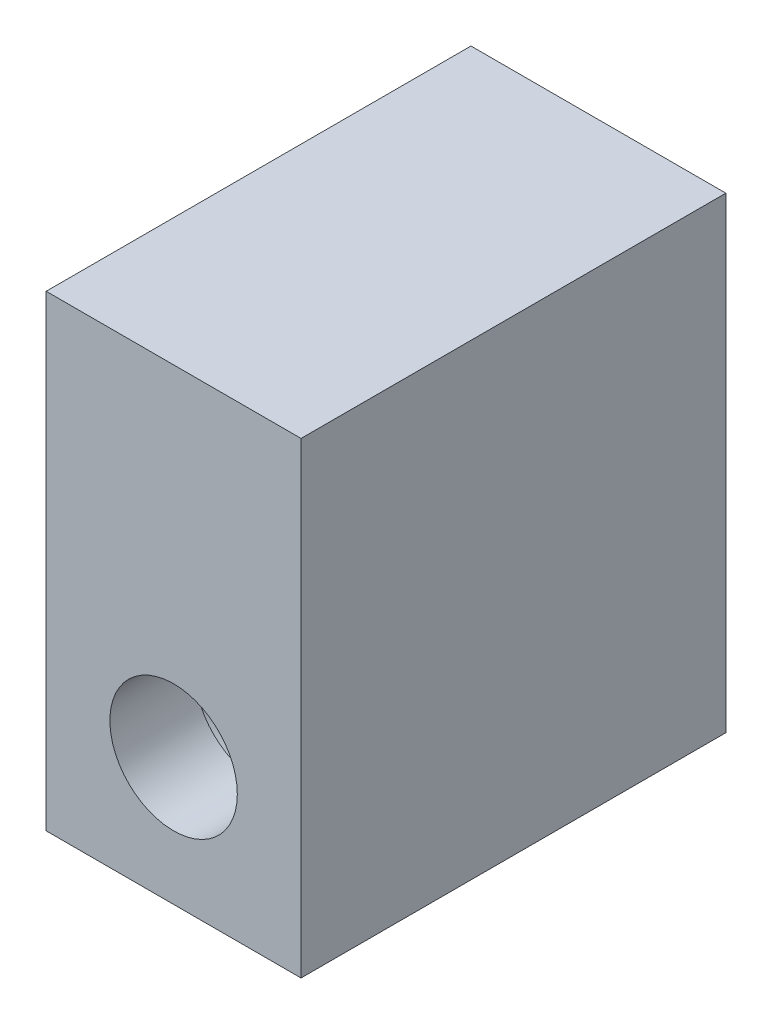
ISO-10303-21;
HEADER;
FILE_DESCRIPTION(('STEP AP214'),'2;1');
FILE_NAME('part.step','',(''),(''),'','','');
FILE_SCHEMA(('AUTOMOTIVE_DESIGN { 1 0 10303 214 1 1 1 1 }'));
ENDSEC;
DATA;
#1=APPLICATION_CONTEXT('core data for automotive mechanical design processes');
#2=APPLICATION_PROTOCOL_DEFINITION('international standard','automotive_design',2000,#1);
#3=PRODUCT_CONTEXT('',#1,'mechanical');
#4=PRODUCT('Part','Part','',(#3));
#5=PRODUCT_RELATED_PRODUCT_CATEGORY('part','',(#4));
#6=PRODUCT_DEFINITION_FORMATION('','',#4);
#7=PRODUCT_DEFINITION_CONTEXT('part definition',#1,'design');
#8=PRODUCT_DEFINITION('design','',#6,#7);
#9=PRODUCT_DEFINITION_SHAPE('','',#8);
#10=(LENGTH_UNIT() NAMED_UNIT(*) SI_UNIT(.MILLI.,.METRE.));
#11=(NAMED_UNIT(*) PLANE_ANGLE_UNIT() SI_UNIT($,.RADIAN.));
#12=(NAMED_UNIT(*) SI_UNIT($,.STERADIAN.) SOLID_ANGLE_UNIT());
#13=UNCERTAINTY_MEASURE_WITH_UNIT(LENGTH_MEASURE(1.E-05),#10,'distance_accuracy_value','');
#14=(GEOMETRIC_REPRESENTATION_CONTEXT(3) GLOBAL_UNCERTAINTY_ASSIGNED_CONTEXT((#13)) GLOBAL_UNIT_ASSIGNED_CONTEXT((#10,
#11,#12)) REPRESENTATION_CONTEXT('',''));
#15=CARTESIAN_POINT('',(0.,0.,0.));
#16=DIRECTION('',(0.,0.,1.));
#17=DIRECTION('',(1.,0.,0.));
#18=AXIS2_PLACEMENT_3D('',#15,#16,#17);
#19=CARTESIAN_POINT('',(0.,0.,10.));
#20=DIRECTION('',(0.,1.,0.));
#21=DIRECTION('',(-1.,0.,0.));
#22=AXIS2_PLACEMENT_3D('',#19,#20,#21);
#23=PLANE('',#22);
#24=DIRECTION('',(-1.,0.,0.));
#25=VECTOR('',#24,1.);
#26=CARTESIAN_POINT('',(0.,0.,-40.));
#27=LINE('',#26,#25);
#28=CARTESIAN_POINT('',(-10.,0.,-40.));
#29=VERTEX_POINT('',#28);
#30=CARTESIAN_POINT('',(-40.,0.,-40.));
#31=VERTEX_POINT('',#30);
#32=EDGE_CURVE('E109',#29,#31,#27,.T.);
#33=ORIENTED_EDGE('',*,*,#32,.F.);
#34=DIRECTION('',(0.,0.,-1.));
#35=VECTOR('',#34,1.);
#36=CARTESIAN_POINT('',(-10.,0.,10.));
#37=LINE('',#36,#35);
#38=CARTESIAN_POINT('',(-10.,0.,10.));
#39=VERTEX_POINT('',#38);
#40=EDGE_CURVE('E55',#39,#29,#37,.T.);
#41=ORIENTED_EDGE('',*,*,#40,.F.);
#42=DIRECTION('',(1.,0.,0.));
#43=VECTOR('',#42,1.);
#44=CARTESIAN_POINT('',(0.,0.,10.));
#45=LINE('',#44,#43);
#46=CARTESIAN_POINT('',(-40.,0.,10.));
#47=VERTEX_POINT('',#46);
#48=EDGE_CURVE('E11',#47,#39,#45,.T.);
#49=ORIENTED_EDGE('',*,*,#48,.F.);
#50=DIRECTION('',(0.,0.,-1.));
#51=VECTOR('',#50,1.);
#52=CARTESIAN_POINT('',(-40.,0.,10.));
#53=LINE('',#52,#51);
#54=EDGE_CURVE('E90',#47,#31,#53,.T.);
#55=ORIENTED_EDGE('',*,*,#54,.T.);
#56=EDGE_LOOP('',(#33,#41,#49,#55));
#57=FACE_BOUND('',#56,.T.);
#58=ADVANCED_FACE('F33',(#57),#23,.F.);
#59=CARTESIAN_POINT('',(0.,0.,10.));
#60=DIRECTION('',(0.,0.,1.));
#61=DIRECTION('',(1.,0.,0.));
#62=AXIS2_PLACEMENT_3D('',#59,#60,#61);
#63=PLANE('',#62);
#64=DIRECTION('',(-1.,0.,0.));
#65=VECTOR('',#64,1.);
#66=CARTESIAN_POINT('',(-10.,55.,10.));
#67=LINE('',#66,#65);
#68=CARTESIAN_POINT('',(-10.,55.,10.));
#69=VERTEX_POINT('',#68);
#70=CARTESIAN_POINT('',(-40.,55.,10.));
#71=VERTEX_POINT('',#70);
#72=EDGE_CURVE('E47',#69,#71,#67,.T.);
#73=ORIENTED_EDGE('',*,*,#72,.T.);
#74=DIRECTION('',(0.,-1.,0.));
#75=VECTOR('',#74,1.);
#76=CARTESIAN_POINT('',(-40.,70.,10.));
#77=LINE('',#76,#75);
#78=EDGE_CURVE('E94',#71,#47,#77,.T.);
#79=ORIENTED_EDGE('',*,*,#78,.T.);
#80=ORIENTED_EDGE('',*,*,#48,.T.);
#81=DIRECTION('',(0.,1.,0.));
#82=VECTOR('',#81,1.);
#83=CARTESIAN_POINT('',(-10.,70.,10.));
#84=LINE('',#83,#82);
#85=EDGE_CURVE('E89',#39,#69,#84,.T.);
#86=ORIENTED_EDGE('',*,*,#85,.T.);
#87=EDGE_LOOP('',(#73,#79,#80,#86));
#88=FACE_BOUND('',#87,.T.);
#89=CARTESIAN_POINT('',(-25.,15.,10.));
#90=DIRECTION('',(0.,0.,1.));
#91=DIRECTION('',(1.,0.,0.));
#92=AXIS2_PLACEMENT_3D('',#89,#90,#91);
#93=CIRCLE('',#92,7.5);
#94=CARTESIAN_POINT('',(-17.5,15.,10.));
#95=VERTEX_POINT('',#94);
#96=EDGE_CURVE('E40',#95,#95,#93,.T.);
#97=ORIENTED_EDGE('',*,*,#96,.F.);
#98=EDGE_LOOP('',(#97));
#99=FACE_BOUND('',#98,.T.);
#100=ADVANCED_FACE('F117',(#88,#99),#63,.T.);
#101=CARTESIAN_POINT('',(-25.,15.,0.));
#102=DIRECTION('',(0.,0.,1.));
#103=DIRECTION('',(1.,0.,0.));
#104=AXIS2_PLACEMENT_3D('',#101,#102,#103);
#105=CYLINDRICAL_SURFACE('',#104,7.5);
#106=CARTESIAN_POINT('',(-25.,15.,0.));
#107=DIRECTION('',(0.,0.,1.));
#108=DIRECTION('',(1.,0.,0.));
#109=AXIS2_PLACEMENT_3D('',#106,#107,#108);
#110=CIRCLE('',#109,7.5);
#111=CARTESIAN_POINT('',(-17.5,15.,0.));
#112=VERTEX_POINT('',#111);
#113=EDGE_CURVE('E106',#112,#112,#110,.T.);
#114=ORIENTED_EDGE('',*,*,#113,.F.);
#115=EDGE_LOOP('',(#114));
#116=FACE_BOUND('',#115,.T.);
#117=ORIENTED_EDGE('',*,*,#96,.T.);
#118=EDGE_LOOP('',(#117));
#119=FACE_BOUND('',#118,.T.);
#120=ADVANCED_FACE('F115',(#116,#119),#105,.F.);
#121=CARTESIAN_POINT('',(0.,0.,-40.));
#122=DIRECTION('',(0.,0.,-1.));
#123=DIRECTION('',(-1.,0.,0.));
#124=AXIS2_PLACEMENT_3D('',#121,#122,#123);
#125=PLANE('',#124);
#126=DIRECTION('',(-1.,0.,0.));
#127=VECTOR('',#126,1.);
#128=CARTESIAN_POINT('',(-10.,55.,-40.));
#129=LINE('',#128,#127);
#130=CARTESIAN_POINT('',(-10.,55.,-40.));
#131=VERTEX_POINT('',#130);
#132=CARTESIAN_POINT('',(-40.,55.,-40.));
#133=VERTEX_POINT('',#132);
#134=EDGE_CURVE('E74',#131,#133,#129,.T.);
#135=ORIENTED_EDGE('',*,*,#134,.F.);
#136=DIRECTION('',(0.,1.,0.));
#137=VECTOR('',#136,1.);
#138=CARTESIAN_POINT('',(-10.,70.,-40.));
#139=LINE('',#138,#137);
#140=EDGE_CURVE('E84',#29,#131,#139,.T.);
#141=ORIENTED_EDGE('',*,*,#140,.F.);
#142=ORIENTED_EDGE('',*,*,#32,.T.);
#143=DIRECTION('',(0.,-1.,0.));
#144=VECTOR('',#143,1.);
#145=CARTESIAN_POINT('',(-40.,70.,-40.));
#146=LINE('',#145,#144);
#147=EDGE_CURVE('E86',#133,#31,#146,.T.);
#148=ORIENTED_EDGE('',*,*,#147,.F.);
#149=EDGE_LOOP('',(#135,#141,#142,#148));
#150=FACE_BOUND('',#149,.T.);
#151=CARTESIAN_POINT('',(-25.,15.,-40.));
#152=DIRECTION('',(0.,0.,-1.));
#153=DIRECTION('',(-1.,0.,0.));
#154=AXIS2_PLACEMENT_3D('',#151,#152,#153);
#155=CIRCLE('',#154,10.5);
#156=CARTESIAN_POINT('',(-35.5,15.,-40.));
#157=VERTEX_POINT('',#156);
#158=EDGE_CURVE('E99',#157,#157,#155,.T.);
#159=ORIENTED_EDGE('',*,*,#158,.F.);
#160=EDGE_LOOP('',(#159));
#161=FACE_BOUND('',#160,.T.);
#162=ADVANCED_FACE('F81',(#150,#161),#125,.T.);
#163=CARTESIAN_POINT('',(-25.,15.,0.));
#164=DIRECTION('',(0.,0.,-1.));
#165=DIRECTION('',(-1.,0.,0.));
#166=AXIS2_PLACEMENT_3D('',#163,#164,#165);
#167=PLANE('',#166);
#168=CARTESIAN_POINT('',(-25.,15.,0.));
#169=DIRECTION('',(0.,0.,-1.));
#170=DIRECTION('',(-1.,0.,0.));
#171=AXIS2_PLACEMENT_3D('',#168,#169,#170);
#172=CIRCLE('',#171,10.5);
#173=CARTESIAN_POINT('',(-35.5,15.,0.));
#174=VERTEX_POINT('',#173);
#175=EDGE_CURVE('E103',#174,#174,#172,.T.);
#176=ORIENTED_EDGE('',*,*,#175,.T.);
#177=EDGE_LOOP('',(#176));
#178=FACE_BOUND('',#177,.T.);
#179=ORIENTED_EDGE('',*,*,#113,.T.);
#180=EDGE_LOOP('',(#179));
#181=FACE_BOUND('',#180,.T.);
#182=ADVANCED_FACE('F130',(#178,#181),#167,.T.);
#183=CARTESIAN_POINT('',(-25.,15.,0.));
#184=DIRECTION('',(0.,0.,-1.));
#185=DIRECTION('',(-1.,0.,0.));
#186=AXIS2_PLACEMENT_3D('',#183,#184,#185);
#187=CYLINDRICAL_SURFACE('',#186,10.5);
#188=ORIENTED_EDGE('',*,*,#175,.F.);
#189=EDGE_LOOP('',(#188));
#190=FACE_BOUND('',#189,.T.);
#191=ORIENTED_EDGE('',*,*,#158,.T.);
#192=EDGE_LOOP('',(#191));
#193=FACE_BOUND('',#192,.T.);
#194=ADVANCED_FACE('F131',(#190,#193),#187,.F.);
#195=CARTESIAN_POINT('',(-40.,70.,10.));
#196=DIRECTION('',(1.,0.,0.));
#197=DIRECTION('',(0.,1.,0.));
#198=AXIS2_PLACEMENT_3D('',#195,#196,#197);
#199=PLANE('',#198);
#200=CARTESIAN_POINT('',(-40.,40.,-27.5));
#201=DIRECTION('',(-1.,0.,0.));
#202=DIRECTION('',(0.,-1.,0.));
#203=AXIS2_PLACEMENT_3D('',#200,#201,#202);
#204=CIRCLE('',#203,6.);
#205=CARTESIAN_POINT('',(-40.,34.,-27.5));
#206=VERTEX_POINT('',#205);
#207=EDGE_CURVE('E242',#206,#206,#204,.T.);
#208=ORIENTED_EDGE('',*,*,#207,.F.);
#209=EDGE_LOOP('',(#208));
#210=FACE_BOUND('',#209,.T.);
#211=CARTESIAN_POINT('',(-40.,40.,-2.5));
#212=DIRECTION('',(-1.,0.,0.));
#213=DIRECTION('',(0.,-1.,0.));
#214=AXIS2_PLACEMENT_3D('',#211,#212,#213);
#215=CIRCLE('',#214,6.);
#216=CARTESIAN_POINT('',(-40.,34.,-2.5));
#217=VERTEX_POINT('',#216);
#218=EDGE_CURVE('E250',#217,#217,#215,.T.);
#219=ORIENTED_EDGE('',*,*,#218,.F.);
#220=EDGE_LOOP('',(#219));
#221=FACE_BOUND('',#220,.T.);
#222=ORIENTED_EDGE('',*,*,#78,.F.);
#223=DIRECTION('',(0.,0.,1.));
#224=VECTOR('',#223,1.);
#225=CARTESIAN_POINT('',(-40.,55.,-40.));
#226=LINE('',#225,#224);
#227=EDGE_CURVE('E77',#133,#71,#226,.T.);
#228=ORIENTED_EDGE('',*,*,#227,.F.);
#229=ORIENTED_EDGE('',*,*,#147,.T.);
#230=ORIENTED_EDGE('',*,*,#54,.F.);
#231=EDGE_LOOP('',(#222,#228,#229,#230));
#232=FACE_BOUND('',#231,.T.);
#233=ADVANCED_FACE('F134',(#210,#221,#232),#199,.F.);
#234=CARTESIAN_POINT('',(-10.,70.,10.));
#235=DIRECTION('',(-1.,0.,0.));
#236=DIRECTION('',(0.,-1.,0.));
#237=AXIS2_PLACEMENT_3D('',#234,#235,#236);
#238=PLANE('',#237);
#239=ORIENTED_EDGE('',*,*,#140,.T.);
#240=DIRECTION('',(0.,0.,1.));
#241=VECTOR('',#240,1.);
#242=CARTESIAN_POINT('',(-10.,55.,-40.));
#243=LINE('',#242,#241);
#244=EDGE_CURVE('E71',#131,#69,#243,.T.);
#245=ORIENTED_EDGE('',*,*,#244,.T.);
#246=ORIENTED_EDGE('',*,*,#85,.F.);
#247=ORIENTED_EDGE('',*,*,#40,.T.);
#248=EDGE_LOOP('',(#239,#245,#246,#247));
#249=FACE_BOUND('',#248,.T.);
#250=ADVANCED_FACE('F88',(#249),#238,.F.);
#251=CARTESIAN_POINT('',(-20.,40.,-2.5));
#252=DIRECTION('',(-1.,0.,0.));
#253=DIRECTION('',(0.,-1.,0.));
#254=AXIS2_PLACEMENT_3D('',#251,#252,#253);
#255=CYLINDRICAL_SURFACE('',#254,6.);
#256=CARTESIAN_POINT('',(-20.,40.,-2.5));
#257=DIRECTION('',(-1.,0.,0.));
#258=DIRECTION('',(0.,-1.,0.));
#259=AXIS2_PLACEMENT_3D('',#256,#257,#258);
#260=CIRCLE('',#259,6.);
#261=CARTESIAN_POINT('',(-20.,34.,-2.5));
#262=VERTEX_POINT('',#261);
#263=EDGE_CURVE('E245',#262,#262,#260,.T.);
#264=ORIENTED_EDGE('',*,*,#263,.F.);
#265=EDGE_LOOP('',(#264));
#266=FACE_BOUND('',#265,.T.);
#267=ORIENTED_EDGE('',*,*,#218,.T.);
#268=EDGE_LOOP('',(#267));
#269=FACE_BOUND('',#268,.T.);
#270=ADVANCED_FACE('F144',(#266,#269),#255,.F.);
#271=CARTESIAN_POINT('',(-20.,40.,-2.5));
#272=DIRECTION('',(-1.,0.,0.));
#273=DIRECTION('',(0.,-1.,0.));
#274=AXIS2_PLACEMENT_3D('',#271,#272,#273);
#275=PLANE('',#274);
#276=ORIENTED_EDGE('',*,*,#263,.T.);
#277=EDGE_LOOP('',(#276));
#278=FACE_BOUND('',#277,.T.);
#279=ADVANCED_FACE('F147',(#278),#275,.T.);
#280=CARTESIAN_POINT('',(-20.,40.,-27.5));
#281=DIRECTION('',(-1.,0.,0.));
#282=DIRECTION('',(0.,-1.,0.));
#283=AXIS2_PLACEMENT_3D('',#280,#281,#282);
#284=CYLINDRICAL_SURFACE('',#283,6.);
#285=CARTESIAN_POINT('',(-20.,40.,-27.5));
#286=DIRECTION('',(-1.,0.,0.));
#287=DIRECTION('',(0.,-1.,0.));
#288=AXIS2_PLACEMENT_3D('',#285,#286,#287);
#289=CIRCLE('',#288,6.);
#290=CARTESIAN_POINT('',(-20.,34.,-27.5));
#291=VERTEX_POINT('',#290);
#292=EDGE_CURVE('E101',#291,#291,#289,.T.);
#293=ORIENTED_EDGE('',*,*,#292,.F.);
#294=EDGE_LOOP('',(#293));
#295=FACE_BOUND('',#294,.T.);
#296=ORIENTED_EDGE('',*,*,#207,.T.);
#297=EDGE_LOOP('',(#296));
#298=FACE_BOUND('',#297,.T.);
#299=ADVANCED_FACE('F151',(#295,#298),#284,.F.);
#300=CARTESIAN_POINT('',(-20.,40.,-27.5));
#301=DIRECTION('',(-1.,0.,0.));
#302=DIRECTION('',(0.,-1.,0.));
#303=AXIS2_PLACEMENT_3D('',#300,#301,#302);
#304=PLANE('',#303);
#305=ORIENTED_EDGE('',*,*,#292,.T.);
#306=EDGE_LOOP('',(#305));
#307=FACE_BOUND('',#306,.T.);
#308=ADVANCED_FACE('F155',(#307),#304,.T.);
#309=CARTESIAN_POINT('',(-10.,55.,-40.));
#310=DIRECTION('',(0.,-1.,0.));
#311=DIRECTION('',(1.,0.,0.));
#312=AXIS2_PLACEMENT_3D('',#309,#310,#311);
#313=PLANE('',#312);
#314=ORIENTED_EDGE('',*,*,#227,.T.);
#315=ORIENTED_EDGE('',*,*,#72,.F.);
#316=ORIENTED_EDGE('',*,*,#244,.F.);
#317=ORIENTED_EDGE('',*,*,#134,.T.);
#318=EDGE_LOOP('',(#314,#315,#316,#317));
#319=FACE_BOUND('',#318,.T.);
#320=ADVANCED_FACE('F73',(#319),#313,.F.);
#321=CLOSED_SHELL('',(#58,#100,#120,#162,#182,#194,#233,#250,#270,#279,#299,#308,#320));
#322=MANIFOLD_SOLID_BREP('B2',#321);
#323=ADVANCED_BREP_SHAPE_REPRESENTATION('',(#18,#322),#14);
#324=SHAPE_DEFINITION_REPRESENTATION(#9,#323);
ENDSEC;
END-ISO-10303-21;
